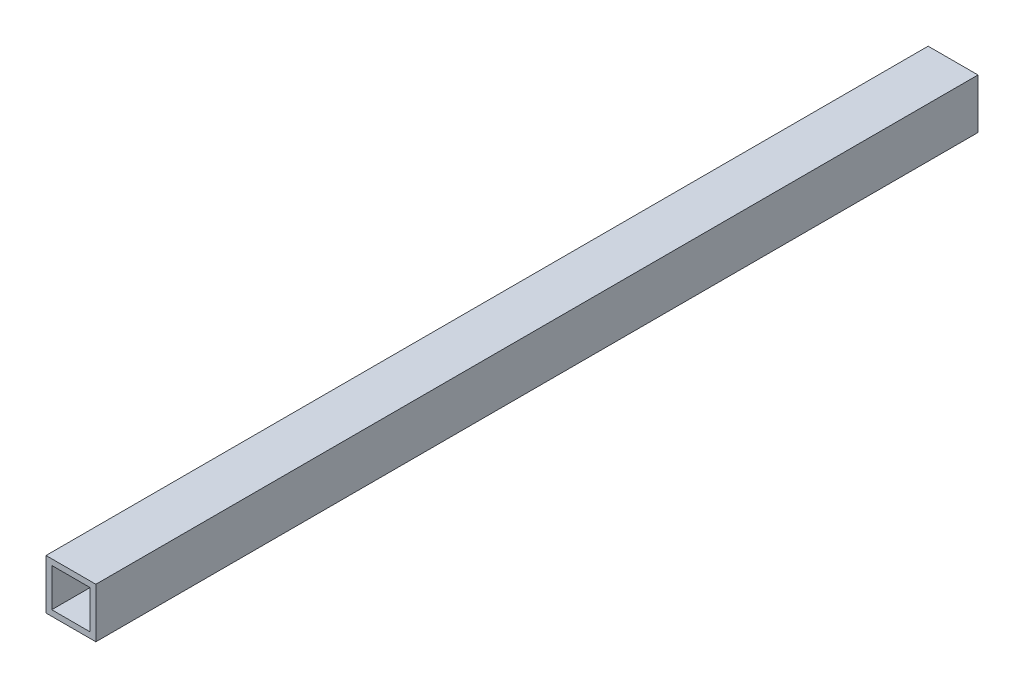
ISO-10303-21;
HEADER;
FILE_DESCRIPTION(('STEP AP214'),'2;1');
FILE_NAME('part.step','',(''),(''),'','','');
FILE_SCHEMA(('AUTOMOTIVE_DESIGN { 1 0 10303 214 1 1 1 1 }'));
ENDSEC;
DATA;
#1=APPLICATION_CONTEXT('core data for automotive mechanical design processes');
#2=APPLICATION_PROTOCOL_DEFINITION('international standard','automotive_design',2000,#1);
#3=PRODUCT_CONTEXT('',#1,'mechanical');
#4=PRODUCT('Part','Part','',(#3));
#5=PRODUCT_RELATED_PRODUCT_CATEGORY('part','',(#4));
#6=PRODUCT_DEFINITION_FORMATION('','',#4);
#7=PRODUCT_DEFINITION_CONTEXT('part definition',#1,'design');
#8=PRODUCT_DEFINITION('design','',#6,#7);
#9=PRODUCT_DEFINITION_SHAPE('','',#8);
#10=(LENGTH_UNIT() NAMED_UNIT(*) SI_UNIT(.MILLI.,.METRE.));
#11=(NAMED_UNIT(*) PLANE_ANGLE_UNIT() SI_UNIT($,.RADIAN.));
#12=(NAMED_UNIT(*) SI_UNIT($,.STERADIAN.) SOLID_ANGLE_UNIT());
#13=UNCERTAINTY_MEASURE_WITH_UNIT(LENGTH_MEASURE(1.E-05),#10,'distance_accuracy_value','');
#14=(GEOMETRIC_REPRESENTATION_CONTEXT(3) GLOBAL_UNCERTAINTY_ASSIGNED_CONTEXT((#13)) GLOBAL_UNIT_ASSIGNED_CONTEXT((#10,
#11,#12)) REPRESENTATION_CONTEXT('',''));
#15=CARTESIAN_POINT('',(0.,0.,0.));
#16=DIRECTION('',(0.,0.,1.));
#17=DIRECTION('',(1.,0.,0.));
#18=AXIS2_PLACEMENT_3D('',#15,#16,#17);
#19=CARTESIAN_POINT('',(0.,0.,230.));
#20=DIRECTION('',(0.,0.,1.));
#21=DIRECTION('',(1.,0.,0.));
#22=AXIS2_PLACEMENT_3D('',#19,#20,#21);
#23=PLANE('',#22);
#24=DIRECTION('',(0.,1.,0.));
#25=VECTOR('',#24,1.);
#26=CARTESIAN_POINT('',(6.5,6.5,230.));
#27=LINE('',#26,#25);
#28=CARTESIAN_POINT('',(6.5,-6.5,230.));
#29=VERTEX_POINT('',#28);
#30=CARTESIAN_POINT('',(6.5,6.5,230.));
#31=VERTEX_POINT('',#30);
#32=EDGE_CURVE('E136',#29,#31,#27,.T.);
#33=ORIENTED_EDGE('',*,*,#32,.T.);
#34=DIRECTION('',(-1.,0.,0.));
#35=VECTOR('',#34,1.);
#36=CARTESIAN_POINT('',(-6.5,6.5,230.));
#37=LINE('',#36,#35);
#38=CARTESIAN_POINT('',(-6.5,6.5,230.));
#39=VERTEX_POINT('',#38);
#40=EDGE_CURVE('E139',#31,#39,#37,.T.);
#41=ORIENTED_EDGE('',*,*,#40,.T.);
#42=DIRECTION('',(0.,-1.,0.));
#43=VECTOR('',#42,1.);
#44=CARTESIAN_POINT('',(-6.5,6.5,230.));
#45=LINE('',#44,#43);
#46=CARTESIAN_POINT('',(-6.5,-6.5,230.));
#47=VERTEX_POINT('',#46);
#48=EDGE_CURVE('E142',#39,#47,#45,.T.);
#49=ORIENTED_EDGE('',*,*,#48,.T.);
#50=DIRECTION('',(1.,0.,0.));
#51=VECTOR('',#50,1.);
#52=CARTESIAN_POINT('',(-6.5,-6.5,230.));
#53=LINE('',#52,#51);
#54=EDGE_CURVE('E144',#47,#29,#53,.T.);
#55=ORIENTED_EDGE('',*,*,#54,.T.);
#56=EDGE_LOOP('',(#33,#41,#49,#55));
#57=FACE_BOUND('',#56,.T.);
#58=DIRECTION('',(-1.,0.,0.));
#59=VECTOR('',#58,1.);
#60=CARTESIAN_POINT('',(-5.,5.00000000000001,230.));
#61=LINE('',#60,#59);
#62=CARTESIAN_POINT('',(5.,5.00000000000001,230.));
#63=VERTEX_POINT('',#62);
#64=CARTESIAN_POINT('',(-5.,5.00000000000001,230.));
#65=VERTEX_POINT('',#64);
#66=EDGE_CURVE('E108',#63,#65,#61,.T.);
#67=ORIENTED_EDGE('',*,*,#66,.F.);
#68=DIRECTION('',(0.,1.,0.));
#69=VECTOR('',#68,1.);
#70=CARTESIAN_POINT('',(5.,-5.,230.));
#71=LINE('',#70,#69);
#72=CARTESIAN_POINT('',(5.,-5.,230.));
#73=VERTEX_POINT('',#72);
#74=EDGE_CURVE('E100',#73,#63,#71,.T.);
#75=ORIENTED_EDGE('',*,*,#74,.F.);
#76=DIRECTION('',(1.,0.,0.));
#77=VECTOR('',#76,1.);
#78=CARTESIAN_POINT('',(-5.,-5.,230.));
#79=LINE('',#78,#77);
#80=CARTESIAN_POINT('',(-5.,-5.,230.));
#81=VERTEX_POINT('',#80);
#82=EDGE_CURVE('E122',#81,#73,#79,.T.);
#83=ORIENTED_EDGE('',*,*,#82,.F.);
#84=DIRECTION('',(0.,-1.,0.));
#85=VECTOR('',#84,1.);
#86=CARTESIAN_POINT('',(-5.,-5.,230.));
#87=LINE('',#86,#85);
#88=EDGE_CURVE('E120',#65,#81,#87,.T.);
#89=ORIENTED_EDGE('',*,*,#88,.F.);
#90=EDGE_LOOP('',(#67,#75,#83,#89));
#91=FACE_BOUND('',#90,.T.);
#92=ADVANCED_FACE('F35',(#57,#91),#23,.T.);
#93=CARTESIAN_POINT('',(0.,0.,0.));
#94=DIRECTION('',(0.,0.,1.));
#95=DIRECTION('',(1.,0.,0.));
#96=AXIS2_PLACEMENT_3D('',#93,#94,#95);
#97=PLANE('',#96);
#98=DIRECTION('',(0.,1.,0.));
#99=VECTOR('',#98,1.);
#100=CARTESIAN_POINT('',(6.5,6.5,0.));
#101=LINE('',#100,#99);
#102=CARTESIAN_POINT('',(6.5,-6.5,0.));
#103=VERTEX_POINT('',#102);
#104=CARTESIAN_POINT('',(6.5,6.5,0.));
#105=VERTEX_POINT('',#104);
#106=EDGE_CURVE('E116',#103,#105,#101,.T.);
#107=ORIENTED_EDGE('',*,*,#106,.F.);
#108=DIRECTION('',(1.,0.,0.));
#109=VECTOR('',#108,1.);
#110=CARTESIAN_POINT('',(-6.5,-6.5,0.));
#111=LINE('',#110,#109);
#112=CARTESIAN_POINT('',(-6.5,-6.5,0.));
#113=VERTEX_POINT('',#112);
#114=EDGE_CURVE('E140',#113,#103,#111,.T.);
#115=ORIENTED_EDGE('',*,*,#114,.F.);
#116=DIRECTION('',(0.,-1.,0.));
#117=VECTOR('',#116,1.);
#118=CARTESIAN_POINT('',(-6.5,6.5,0.));
#119=LINE('',#118,#117);
#120=CARTESIAN_POINT('',(-6.5,6.5,0.));
#121=VERTEX_POINT('',#120);
#122=EDGE_CURVE('E151',#121,#113,#119,.T.);
#123=ORIENTED_EDGE('',*,*,#122,.F.);
#124=DIRECTION('',(-1.,0.,0.));
#125=VECTOR('',#124,1.);
#126=CARTESIAN_POINT('',(-6.5,6.5,0.));
#127=LINE('',#126,#125);
#128=EDGE_CURVE('E149',#105,#121,#127,.T.);
#129=ORIENTED_EDGE('',*,*,#128,.F.);
#130=EDGE_LOOP('',(#107,#115,#123,#129));
#131=FACE_BOUND('',#130,.T.);
#132=DIRECTION('',(0.,1.,0.));
#133=VECTOR('',#132,1.);
#134=CARTESIAN_POINT('',(5.,-5.,0.));
#135=LINE('',#134,#133);
#136=CARTESIAN_POINT('',(5.,-5.,0.));
#137=VERTEX_POINT('',#136);
#138=CARTESIAN_POINT('',(5.,5.00000000000001,0.));
#139=VERTEX_POINT('',#138);
#140=EDGE_CURVE('E58',#137,#139,#135,.T.);
#141=ORIENTED_EDGE('',*,*,#140,.T.);
#142=DIRECTION('',(-1.,0.,0.));
#143=VECTOR('',#142,1.);
#144=CARTESIAN_POINT('',(-5.,5.00000000000001,0.));
#145=LINE('',#144,#143);
#146=CARTESIAN_POINT('',(-5.,5.00000000000001,0.));
#147=VERTEX_POINT('',#146);
#148=EDGE_CURVE('E115',#139,#147,#145,.T.);
#149=ORIENTED_EDGE('',*,*,#148,.T.);
#150=DIRECTION('',(0.,-1.,0.));
#151=VECTOR('',#150,1.);
#152=CARTESIAN_POINT('',(-5.,-5.,0.));
#153=LINE('',#152,#151);
#154=CARTESIAN_POINT('',(-5.,-5.,0.));
#155=VERTEX_POINT('',#154);
#156=EDGE_CURVE('E128',#147,#155,#153,.T.);
#157=ORIENTED_EDGE('',*,*,#156,.T.);
#158=DIRECTION('',(1.,0.,0.));
#159=VECTOR('',#158,1.);
#160=CARTESIAN_POINT('',(-5.,-5.,0.));
#161=LINE('',#160,#159);
#162=EDGE_CURVE('E109',#155,#137,#161,.T.);
#163=ORIENTED_EDGE('',*,*,#162,.T.);
#164=EDGE_LOOP('',(#141,#149,#157,#163));
#165=FACE_BOUND('',#164,.T.);
#166=ADVANCED_FACE('F169',(#131,#165),#97,.F.);
#167=CARTESIAN_POINT('',(6.5,6.5,230.));
#168=DIRECTION('',(-1.,0.,0.));
#169=DIRECTION('',(0.,0.,1.));
#170=AXIS2_PLACEMENT_3D('',#167,#168,#169);
#171=PLANE('',#170);
#172=ORIENTED_EDGE('',*,*,#106,.T.);
#173=DIRECTION('',(0.,0.,-1.));
#174=VECTOR('',#173,1.);
#175=CARTESIAN_POINT('',(6.5,6.5,230.));
#176=LINE('',#175,#174);
#177=EDGE_CURVE('E11',#31,#105,#176,.T.);
#178=ORIENTED_EDGE('',*,*,#177,.F.);
#179=ORIENTED_EDGE('',*,*,#32,.F.);
#180=DIRECTION('',(0.,0.,-1.));
#181=VECTOR('',#180,1.);
#182=CARTESIAN_POINT('',(6.5,-6.5,230.));
#183=LINE('',#182,#181);
#184=EDGE_CURVE('E146',#29,#103,#183,.T.);
#185=ORIENTED_EDGE('',*,*,#184,.T.);
#186=EDGE_LOOP('',(#172,#178,#179,#185));
#187=FACE_BOUND('',#186,.T.);
#188=ADVANCED_FACE('F37',(#187),#171,.F.);
#189=CARTESIAN_POINT('',(-6.5,6.5,230.));
#190=DIRECTION('',(0.,-1.,0.));
#191=DIRECTION('',(0.,0.,-1.));
#192=AXIS2_PLACEMENT_3D('',#189,#190,#191);
#193=PLANE('',#192);
#194=ORIENTED_EDGE('',*,*,#128,.T.);
#195=DIRECTION('',(0.,0.,-1.));
#196=VECTOR('',#195,1.);
#197=CARTESIAN_POINT('',(-6.5,6.5,230.));
#198=LINE('',#197,#196);
#199=EDGE_CURVE('E43',#39,#121,#198,.T.);
#200=ORIENTED_EDGE('',*,*,#199,.F.);
#201=ORIENTED_EDGE('',*,*,#40,.F.);
#202=ORIENTED_EDGE('',*,*,#177,.T.);
#203=EDGE_LOOP('',(#194,#200,#201,#202));
#204=FACE_BOUND('',#203,.T.);
#205=ADVANCED_FACE('F179',(#204),#193,.F.);
#206=CARTESIAN_POINT('',(-6.5,6.5,230.));
#207=DIRECTION('',(1.,0.,0.));
#208=DIRECTION('',(0.,0.,-1.));
#209=AXIS2_PLACEMENT_3D('',#206,#207,#208);
#210=PLANE('',#209);
#211=ORIENTED_EDGE('',*,*,#122,.T.);
#212=DIRECTION('',(0.,0.,-1.));
#213=VECTOR('',#212,1.);
#214=CARTESIAN_POINT('',(-6.5,-6.5,230.));
#215=LINE('',#214,#213);
#216=EDGE_CURVE('E156',#47,#113,#215,.T.);
#217=ORIENTED_EDGE('',*,*,#216,.F.);
#218=ORIENTED_EDGE('',*,*,#48,.F.);
#219=ORIENTED_EDGE('',*,*,#199,.T.);
#220=EDGE_LOOP('',(#211,#217,#218,#219));
#221=FACE_BOUND('',#220,.T.);
#222=ADVANCED_FACE('F163',(#221),#210,.F.);
#223=CARTESIAN_POINT('',(-6.5,-6.5,230.));
#224=DIRECTION('',(0.,1.,0.));
#225=DIRECTION('',(0.,0.,1.));
#226=AXIS2_PLACEMENT_3D('',#223,#224,#225);
#227=PLANE('',#226);
#228=ORIENTED_EDGE('',*,*,#114,.T.);
#229=ORIENTED_EDGE('',*,*,#184,.F.);
#230=ORIENTED_EDGE('',*,*,#54,.F.);
#231=ORIENTED_EDGE('',*,*,#216,.T.);
#232=EDGE_LOOP('',(#228,#229,#230,#231));
#233=FACE_BOUND('',#232,.T.);
#234=ADVANCED_FACE('F173',(#233),#227,.F.);
#235=CARTESIAN_POINT('',(5.,-5.,230.));
#236=DIRECTION('',(-1.,0.,0.));
#237=DIRECTION('',(0.,0.,1.));
#238=AXIS2_PLACEMENT_3D('',#235,#236,#237);
#239=PLANE('',#238);
#240=ORIENTED_EDGE('',*,*,#140,.F.);
#241=DIRECTION('',(0.,0.,-1.));
#242=VECTOR('',#241,1.);
#243=CARTESIAN_POINT('',(5.,-5.,230.));
#244=LINE('',#243,#242);
#245=EDGE_CURVE('E104',#73,#137,#244,.T.);
#246=ORIENTED_EDGE('',*,*,#245,.F.);
#247=ORIENTED_EDGE('',*,*,#74,.T.);
#248=DIRECTION('',(0.,0.,-1.));
#249=VECTOR('',#248,1.);
#250=CARTESIAN_POINT('',(5.,5.00000000000001,230.));
#251=LINE('',#250,#249);
#252=EDGE_CURVE('E103',#63,#139,#251,.T.);
#253=ORIENTED_EDGE('',*,*,#252,.T.);
#254=EDGE_LOOP('',(#240,#246,#247,#253));
#255=FACE_BOUND('',#254,.T.);
#256=ADVANCED_FACE('F102',(#255),#239,.T.);
#257=CARTESIAN_POINT('',(-5.,5.00000000000001,230.));
#258=DIRECTION('',(0.,-1.,0.));
#259=DIRECTION('',(0.,0.,-1.));
#260=AXIS2_PLACEMENT_3D('',#257,#258,#259);
#261=PLANE('',#260);
#262=ORIENTED_EDGE('',*,*,#148,.F.);
#263=ORIENTED_EDGE('',*,*,#252,.F.);
#264=ORIENTED_EDGE('',*,*,#66,.T.);
#265=DIRECTION('',(0.,0.,-1.));
#266=VECTOR('',#265,1.);
#267=CARTESIAN_POINT('',(-5.,5.00000000000001,230.));
#268=LINE('',#267,#266);
#269=EDGE_CURVE('E117',#65,#147,#268,.T.);
#270=ORIENTED_EDGE('',*,*,#269,.T.);
#271=EDGE_LOOP('',(#262,#263,#264,#270));
#272=FACE_BOUND('',#271,.T.);
#273=ADVANCED_FACE('F112',(#272),#261,.T.);
#274=CARTESIAN_POINT('',(-5.,-5.,230.));
#275=DIRECTION('',(1.,0.,0.));
#276=DIRECTION('',(0.,0.,-1.));
#277=AXIS2_PLACEMENT_3D('',#274,#275,#276);
#278=PLANE('',#277);
#279=ORIENTED_EDGE('',*,*,#156,.F.);
#280=ORIENTED_EDGE('',*,*,#269,.F.);
#281=ORIENTED_EDGE('',*,*,#88,.T.);
#282=DIRECTION('',(0.,0.,-1.));
#283=VECTOR('',#282,1.);
#284=CARTESIAN_POINT('',(-5.,-5.,230.));
#285=LINE('',#284,#283);
#286=EDGE_CURVE('E50',#81,#155,#285,.T.);
#287=ORIENTED_EDGE('',*,*,#286,.T.);
#288=EDGE_LOOP('',(#279,#280,#281,#287));
#289=FACE_BOUND('',#288,.T.);
#290=ADVANCED_FACE('F202',(#289),#278,.T.);
#291=CARTESIAN_POINT('',(-5.,-5.,230.));
#292=DIRECTION('',(0.,1.,0.));
#293=DIRECTION('',(0.,0.,1.));
#294=AXIS2_PLACEMENT_3D('',#291,#292,#293);
#295=PLANE('',#294);
#296=ORIENTED_EDGE('',*,*,#162,.F.);
#297=ORIENTED_EDGE('',*,*,#286,.F.);
#298=ORIENTED_EDGE('',*,*,#82,.T.);
#299=ORIENTED_EDGE('',*,*,#245,.T.);
#300=EDGE_LOOP('',(#296,#297,#298,#299));
#301=FACE_BOUND('',#300,.T.);
#302=ADVANCED_FACE('F206',(#301),#295,.T.);
#303=CLOSED_SHELL('',(#92,#166,#188,#205,#222,#234,#256,#273,#290,#302));
#304=MANIFOLD_SOLID_BREP('B2',#303);
#305=ADVANCED_BREP_SHAPE_REPRESENTATION('',(#18,#304),#14);
#306=SHAPE_DEFINITION_REPRESENTATION(#9,#305);
ENDSEC;
END-ISO-10303-21;
